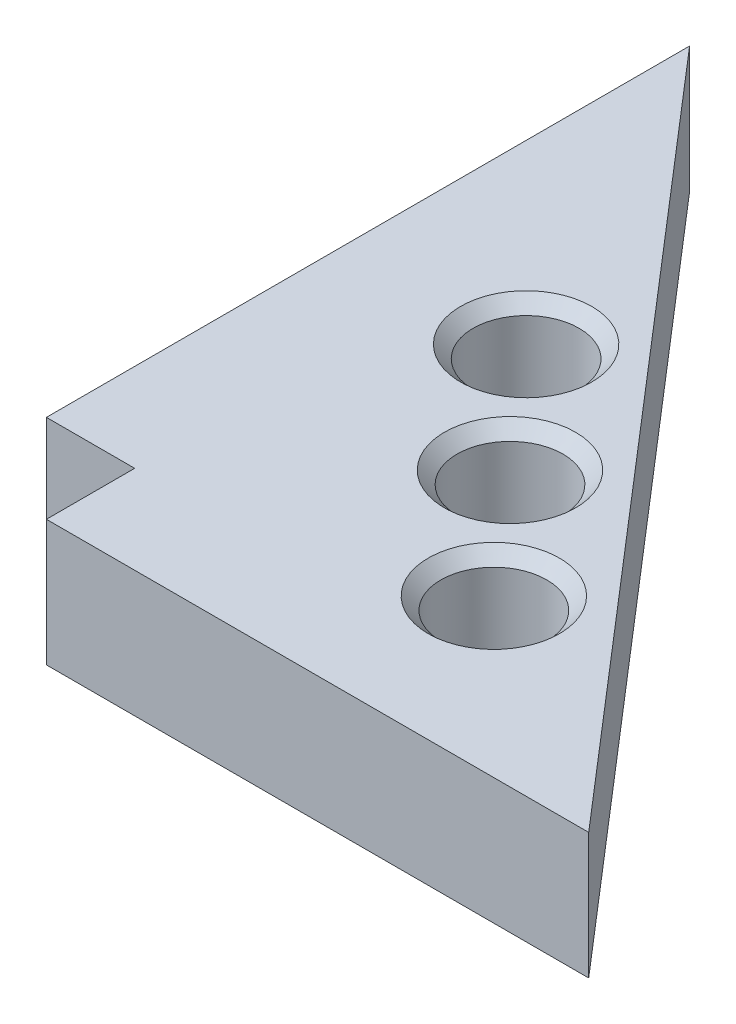
ISO-10303-21;
HEADER;
FILE_DESCRIPTION(('STEP AP214'),'2;1');
FILE_NAME('part.step','',(''),(''),'','','');
FILE_SCHEMA(('AUTOMOTIVE_DESIGN { 1 0 10303 214 1 1 1 1 }'));
ENDSEC;
DATA;
#1=APPLICATION_CONTEXT('core data for automotive mechanical design processes');
#2=APPLICATION_PROTOCOL_DEFINITION('international standard','automotive_design',2000,#1);
#3=PRODUCT_CONTEXT('',#1,'mechanical');
#4=PRODUCT('Part','Part','',(#3));
#5=PRODUCT_RELATED_PRODUCT_CATEGORY('part','',(#4));
#6=PRODUCT_DEFINITION_FORMATION('','',#4);
#7=PRODUCT_DEFINITION_CONTEXT('part definition',#1,'design');
#8=PRODUCT_DEFINITION('design','',#6,#7);
#9=PRODUCT_DEFINITION_SHAPE('','',#8);
#10=(LENGTH_UNIT() NAMED_UNIT(*) SI_UNIT(.MILLI.,.METRE.));
#11=(NAMED_UNIT(*) PLANE_ANGLE_UNIT() SI_UNIT($,.RADIAN.));
#12=(NAMED_UNIT(*) SI_UNIT($,.STERADIAN.) SOLID_ANGLE_UNIT());
#13=UNCERTAINTY_MEASURE_WITH_UNIT(LENGTH_MEASURE(1.E-05),#10,'distance_accuracy_value','');
#14=(GEOMETRIC_REPRESENTATION_CONTEXT(3) GLOBAL_UNCERTAINTY_ASSIGNED_CONTEXT((#13)) GLOBAL_UNIT_ASSIGNED_CONTEXT((#10,
#11,#12)) REPRESENTATION_CONTEXT('',''));
#15=CARTESIAN_POINT('',(0.,0.,0.));
#16=DIRECTION('',(0.,0.,1.));
#17=DIRECTION('',(1.,0.,0.));
#18=AXIS2_PLACEMENT_3D('',#15,#16,#17);
#19=CARTESIAN_POINT('',(0.,3.175,0.));
#20=DIRECTION('',(0.,-1.,0.));
#21=DIRECTION('',(0.,0.,-1.));
#22=AXIS2_PLACEMENT_3D('',#19,#20,#21);
#23=PLANE('',#22);
#24=CARTESIAN_POINT('',(19.05,3.175,-7.92432613589635));
#25=DIRECTION('',(0.,-1.,0.));
#26=DIRECTION('',(0.,0.,-1.));
#27=AXIS2_PLACEMENT_3D('',#24,#25,#26);
#28=CIRCLE('',#27,3.302);
#29=CARTESIAN_POINT('',(19.05,3.175,-4.62232613589635));
#30=VERTEX_POINT('',#29);
#31=EDGE_CURVE('E13',#30,#30,#28,.T.);
#32=ORIENTED_EDGE('',*,*,#31,.T.);
#33=EDGE_LOOP('',(#32));
#34=FACE_BOUND('',#33,.T.);
#35=CARTESIAN_POINT('',(13.97,3.175,-13.8171261358963));
#36=DIRECTION('',(0.,-1.,0.));
#37=DIRECTION('',(0.,0.,-1.));
#38=AXIS2_PLACEMENT_3D('',#35,#36,#37);
#39=CIRCLE('',#38,3.30200000000001);
#40=CARTESIAN_POINT('',(13.97,3.175,-17.1191261358964));
#41=VERTEX_POINT('',#40);
#42=EDGE_CURVE('E67',#41,#41,#39,.T.);
#43=ORIENTED_EDGE('',*,*,#42,.T.);
#44=EDGE_LOOP('',(#43));
#45=FACE_BOUND('',#44,.T.);
#46=CARTESIAN_POINT('',(8.89,3.175,-19.7099261358963));
#47=DIRECTION('',(0.,-1.,0.));
#48=DIRECTION('',(0.,0.,-1.));
#49=AXIS2_PLACEMENT_3D('',#46,#47,#48);
#50=CIRCLE('',#49,3.30200000000001);
#51=CARTESIAN_POINT('',(8.89,3.175,-23.0119261358964));
#52=VERTEX_POINT('',#51);
#53=EDGE_CURVE('E175',#52,#52,#50,.T.);
#54=ORIENTED_EDGE('',*,*,#53,.T.);
#55=EDGE_LOOP('',(#54));
#56=FACE_BOUND('',#55,.T.);
#57=DIRECTION('',(-0.652939622069463,0.,-0.757409961600577));
#58=VECTOR('',#57,1.);
#59=CARTESIAN_POINT('',(31.75,3.175,0.));
#60=LINE('',#59,#58);
#61=CARTESIAN_POINT('',(31.75,3.175,0.));
#62=VERTEX_POINT('',#61);
#63=CARTESIAN_POINT('',(0.,3.175,-36.83));
#64=VERTEX_POINT('',#63);
#65=EDGE_CURVE('E142',#62,#64,#60,.T.);
#66=ORIENTED_EDGE('',*,*,#65,.T.);
#67=DIRECTION('',(0.,0.,1.));
#68=VECTOR('',#67,1.);
#69=CARTESIAN_POINT('',(0.,3.175,-36.83));
#70=LINE('',#69,#68);
#71=CARTESIAN_POINT('',(0.,3.175,-4.445));
#72=VERTEX_POINT('',#71);
#73=EDGE_CURVE('E110',#64,#72,#70,.T.);
#74=ORIENTED_EDGE('',*,*,#73,.T.);
#75=DIRECTION('',(1.,0.,0.));
#76=VECTOR('',#75,1.);
#77=CARTESIAN_POINT('',(0.,3.175,-4.445));
#78=LINE('',#77,#76);
#79=CARTESIAN_POINT('',(4.445,3.175,-4.445));
#80=VERTEX_POINT('',#79);
#81=EDGE_CURVE('E114',#72,#80,#78,.T.);
#82=ORIENTED_EDGE('',*,*,#81,.T.);
#83=DIRECTION('',(0.,0.,1.));
#84=VECTOR('',#83,1.);
#85=CARTESIAN_POINT('',(4.445,3.175,-4.445));
#86=LINE('',#85,#84);
#87=CARTESIAN_POINT('',(4.445,3.175,0.));
#88=VERTEX_POINT('',#87);
#89=EDGE_CURVE('E117',#80,#88,#86,.T.);
#90=ORIENTED_EDGE('',*,*,#89,.T.);
#91=DIRECTION('',(1.,0.,0.));
#92=VECTOR('',#91,1.);
#93=CARTESIAN_POINT('',(4.445,3.175,0.));
#94=LINE('',#93,#92);
#95=EDGE_CURVE('E75',#88,#62,#94,.T.);
#96=ORIENTED_EDGE('',*,*,#95,.T.);
#97=EDGE_LOOP('',(#66,#74,#82,#90,#96));
#98=FACE_BOUND('',#97,.T.);
#99=ADVANCED_FACE('F57',(#34,#45,#56,#98),#23,.F.);
#100=CARTESIAN_POINT('',(0.,-3.175,0.));
#101=DIRECTION('',(0.,-1.,0.));
#102=DIRECTION('',(0.,0.,-1.));
#103=AXIS2_PLACEMENT_3D('',#100,#101,#102);
#104=PLANE('',#103);
#105=CARTESIAN_POINT('',(19.05,-3.175,-7.92432613589635));
#106=DIRECTION('',(0.,-1.,0.));
#107=DIRECTION('',(0.,0.,-1.));
#108=AXIS2_PLACEMENT_3D('',#105,#106,#107);
#109=CIRCLE('',#108,3.30199999999999);
#110=CARTESIAN_POINT('',(19.05,-3.175,-11.2263261358963));
#111=VERTEX_POINT('',#110);
#112=EDGE_CURVE('E154',#111,#111,#109,.F.);
#113=ORIENTED_EDGE('',*,*,#112,.T.);
#114=EDGE_LOOP('',(#113));
#115=FACE_BOUND('',#114,.T.);
#116=CARTESIAN_POINT('',(13.97,-3.175,-13.8171261358963));
#117=DIRECTION('',(0.,-1.,0.));
#118=DIRECTION('',(0.,0.,-1.));
#119=AXIS2_PLACEMENT_3D('',#116,#117,#118);
#120=CIRCLE('',#119,3.30199999999999);
#121=CARTESIAN_POINT('',(13.97,-3.175,-17.1191261358963));
#122=VERTEX_POINT('',#121);
#123=EDGE_CURVE('E151',#122,#122,#120,.F.);
#124=ORIENTED_EDGE('',*,*,#123,.T.);
#125=EDGE_LOOP('',(#124));
#126=FACE_BOUND('',#125,.T.);
#127=CARTESIAN_POINT('',(8.89,-3.175,-19.7099261358963));
#128=DIRECTION('',(0.,-1.,0.));
#129=DIRECTION('',(0.,0.,-1.));
#130=AXIS2_PLACEMENT_3D('',#127,#128,#129);
#131=CIRCLE('',#130,3.302);
#132=CARTESIAN_POINT('',(8.89,-3.175,-23.0119261358963));
#133=VERTEX_POINT('',#132);
#134=EDGE_CURVE('E148',#133,#133,#131,.F.);
#135=ORIENTED_EDGE('',*,*,#134,.T.);
#136=EDGE_LOOP('',(#135));
#137=FACE_BOUND('',#136,.T.);
#138=DIRECTION('',(-0.652939622069463,0.,-0.757409961600577));
#139=VECTOR('',#138,1.);
#140=CARTESIAN_POINT('',(31.75,-3.175,0.));
#141=LINE('',#140,#139);
#142=CARTESIAN_POINT('',(31.75,-3.175,0.));
#143=VERTEX_POINT('',#142);
#144=CARTESIAN_POINT('',(0.,-3.175,-36.83));
#145=VERTEX_POINT('',#144);
#146=EDGE_CURVE('E134',#143,#145,#141,.T.);
#147=ORIENTED_EDGE('',*,*,#146,.F.);
#148=DIRECTION('',(1.,0.,0.));
#149=VECTOR('',#148,1.);
#150=CARTESIAN_POINT('',(4.445,-3.175,0.));
#151=LINE('',#150,#149);
#152=CARTESIAN_POINT('',(4.445,-3.175,0.));
#153=VERTEX_POINT('',#152);
#154=EDGE_CURVE('E101',#153,#143,#151,.T.);
#155=ORIENTED_EDGE('',*,*,#154,.F.);
#156=DIRECTION('',(0.,0.,1.));
#157=VECTOR('',#156,1.);
#158=CARTESIAN_POINT('',(4.445,-3.175,-4.445));
#159=LINE('',#158,#157);
#160=CARTESIAN_POINT('',(4.445,-3.175,-4.445));
#161=VERTEX_POINT('',#160);
#162=EDGE_CURVE('E95',#161,#153,#159,.T.);
#163=ORIENTED_EDGE('',*,*,#162,.F.);
#164=DIRECTION('',(1.,0.,0.));
#165=VECTOR('',#164,1.);
#166=CARTESIAN_POINT('',(0.,-3.175,-4.445));
#167=LINE('',#166,#165);
#168=CARTESIAN_POINT('',(0.,-3.175,-4.445));
#169=VERTEX_POINT('',#168);
#170=EDGE_CURVE('E124',#169,#161,#167,.T.);
#171=ORIENTED_EDGE('',*,*,#170,.F.);
#172=DIRECTION('',(0.,0.,1.));
#173=VECTOR('',#172,1.);
#174=CARTESIAN_POINT('',(0.,-3.175,-36.83));
#175=LINE('',#174,#173);
#176=EDGE_CURVE('E137',#145,#169,#175,.T.);
#177=ORIENTED_EDGE('',*,*,#176,.F.);
#178=EDGE_LOOP('',(#147,#155,#163,#171,#177));
#179=FACE_BOUND('',#178,.T.);
#180=ADVANCED_FACE('F205',(#115,#126,#137,#179),#104,.T.);
#181=CARTESIAN_POINT('',(31.75,3.175,0.));
#182=DIRECTION('',(-0.757409961600577,0.,0.652939622069463));
#183=DIRECTION('',(0.652939622069463,0.,0.757409961600577));
#184=AXIS2_PLACEMENT_3D('',#181,#182,#183);
#185=PLANE('',#184);
#186=ORIENTED_EDGE('',*,*,#146,.T.);
#187=DIRECTION('',(0.,-1.,0.));
#188=VECTOR('',#187,1.);
#189=CARTESIAN_POINT('',(0.,3.175,-36.83));
#190=LINE('',#189,#188);
#191=EDGE_CURVE('E146',#64,#145,#190,.T.);
#192=ORIENTED_EDGE('',*,*,#191,.F.);
#193=ORIENTED_EDGE('',*,*,#65,.F.);
#194=DIRECTION('',(0.,-1.,0.));
#195=VECTOR('',#194,1.);
#196=CARTESIAN_POINT('',(31.75,3.175,0.));
#197=LINE('',#196,#195);
#198=EDGE_CURVE('E130',#62,#143,#197,.T.);
#199=ORIENTED_EDGE('',*,*,#198,.T.);
#200=EDGE_LOOP('',(#186,#192,#193,#199));
#201=FACE_BOUND('',#200,.T.);
#202=ADVANCED_FACE('F212',(#201),#185,.F.);
#203=CARTESIAN_POINT('',(0.,3.175,-36.83));
#204=DIRECTION('',(1.,0.,0.));
#205=DIRECTION('',(0.,0.,-1.));
#206=AXIS2_PLACEMENT_3D('',#203,#204,#205);
#207=PLANE('',#206);
#208=ORIENTED_EDGE('',*,*,#176,.T.);
#209=DIRECTION('',(0.,-1.,0.));
#210=VECTOR('',#209,1.);
#211=CARTESIAN_POINT('',(0.,3.175,-4.445));
#212=LINE('',#211,#210);
#213=EDGE_CURVE('E125',#72,#169,#212,.T.);
#214=ORIENTED_EDGE('',*,*,#213,.F.);
#215=ORIENTED_EDGE('',*,*,#73,.F.);
#216=ORIENTED_EDGE('',*,*,#191,.T.);
#217=EDGE_LOOP('',(#208,#214,#215,#216));
#218=FACE_BOUND('',#217,.T.);
#219=ADVANCED_FACE('F221',(#218),#207,.F.);
#220=CARTESIAN_POINT('',(0.,3.175,-4.445));
#221=DIRECTION('',(0.,0.,-1.));
#222=DIRECTION('',(-1.,0.,0.));
#223=AXIS2_PLACEMENT_3D('',#220,#221,#222);
#224=PLANE('',#223);
#225=ORIENTED_EDGE('',*,*,#170,.T.);
#226=DIRECTION('',(0.,-1.,0.));
#227=VECTOR('',#226,1.);
#228=CARTESIAN_POINT('',(4.445,3.175,-4.445));
#229=LINE('',#228,#227);
#230=EDGE_CURVE('E121',#80,#161,#229,.T.);
#231=ORIENTED_EDGE('',*,*,#230,.F.);
#232=ORIENTED_EDGE('',*,*,#81,.F.);
#233=ORIENTED_EDGE('',*,*,#213,.T.);
#234=EDGE_LOOP('',(#225,#231,#232,#233));
#235=FACE_BOUND('',#234,.T.);
#236=ADVANCED_FACE('F122',(#235),#224,.F.);
#237=CARTESIAN_POINT('',(4.445,3.175,-4.445));
#238=DIRECTION('',(1.,0.,0.));
#239=DIRECTION('',(0.,0.,-1.));
#240=AXIS2_PLACEMENT_3D('',#237,#238,#239);
#241=PLANE('',#240);
#242=ORIENTED_EDGE('',*,*,#162,.T.);
#243=DIRECTION('',(0.,-1.,0.));
#244=VECTOR('',#243,1.);
#245=CARTESIAN_POINT('',(4.445,3.175,0.));
#246=LINE('',#245,#244);
#247=EDGE_CURVE('E126',#88,#153,#246,.T.);
#248=ORIENTED_EDGE('',*,*,#247,.F.);
#249=ORIENTED_EDGE('',*,*,#89,.F.);
#250=ORIENTED_EDGE('',*,*,#230,.T.);
#251=EDGE_LOOP('',(#242,#248,#249,#250));
#252=FACE_BOUND('',#251,.T.);
#253=ADVANCED_FACE('F128',(#252),#241,.F.);
#254=CARTESIAN_POINT('',(4.445,3.175,0.));
#255=DIRECTION('',(0.,0.,-1.));
#256=DIRECTION('',(-1.,0.,0.));
#257=AXIS2_PLACEMENT_3D('',#254,#255,#256);
#258=PLANE('',#257);
#259=ORIENTED_EDGE('',*,*,#154,.T.);
#260=ORIENTED_EDGE('',*,*,#198,.F.);
#261=ORIENTED_EDGE('',*,*,#95,.F.);
#262=ORIENTED_EDGE('',*,*,#247,.T.);
#263=EDGE_LOOP('',(#259,#260,#261,#262));
#264=FACE_BOUND('',#263,.T.);
#265=ADVANCED_FACE('F201',(#264),#258,.F.);
#266=CARTESIAN_POINT('',(8.89,3.175,-19.7099261358963));
#267=DIRECTION('',(0.,-1.,0.));
#268=DIRECTION('',(0.,0.,-1.));
#269=AXIS2_PLACEMENT_3D('',#266,#267,#268);
#270=CYLINDRICAL_SURFACE('',#269,2.667);
#271=CARTESIAN_POINT('',(8.89,-2.54,-19.7099261358963));
#272=DIRECTION('',(0.,-1.,0.));
#273=DIRECTION('',(0.,0.,-1.));
#274=AXIS2_PLACEMENT_3D('',#271,#272,#273);
#275=CIRCLE('',#274,2.667);
#276=CARTESIAN_POINT('',(8.89,-2.54,-22.3769261358963));
#277=VERTEX_POINT('',#276);
#278=EDGE_CURVE('E172',#277,#277,#275,.T.);
#279=ORIENTED_EDGE('',*,*,#278,.T.);
#280=EDGE_LOOP('',(#279));
#281=FACE_BOUND('',#280,.T.);
#282=CARTESIAN_POINT('',(8.89,2.53999999999999,-19.7099261358963));
#283=DIRECTION('',(0.,-1.,0.));
#284=DIRECTION('',(0.,0.,-1.));
#285=AXIS2_PLACEMENT_3D('',#282,#283,#284);
#286=CIRCLE('',#285,2.667);
#287=CARTESIAN_POINT('',(8.89,2.53999999999999,-22.3769261358963));
#288=VERTEX_POINT('',#287);
#289=EDGE_CURVE('E169',#288,#288,#286,.F.);
#290=ORIENTED_EDGE('',*,*,#289,.T.);
#291=EDGE_LOOP('',(#290));
#292=FACE_BOUND('',#291,.T.);
#293=ADVANCED_FACE('F191',(#281,#292),#270,.F.);
#294=CARTESIAN_POINT('',(13.97,3.175,-13.8171261358963));
#295=DIRECTION('',(0.,-1.,0.));
#296=DIRECTION('',(0.,0.,-1.));
#297=AXIS2_PLACEMENT_3D('',#294,#295,#296);
#298=CYLINDRICAL_SURFACE('',#297,2.667);
#299=CARTESIAN_POINT('',(13.97,-2.54,-13.8171261358963));
#300=DIRECTION('',(0.,-1.,0.));
#301=DIRECTION('',(0.,0.,-1.));
#302=AXIS2_PLACEMENT_3D('',#299,#300,#301);
#303=CIRCLE('',#302,2.667);
#304=CARTESIAN_POINT('',(13.97,-2.54,-16.4841261358963));
#305=VERTEX_POINT('',#304);
#306=EDGE_CURVE('E166',#305,#305,#303,.T.);
#307=ORIENTED_EDGE('',*,*,#306,.T.);
#308=EDGE_LOOP('',(#307));
#309=FACE_BOUND('',#308,.T.);
#310=CARTESIAN_POINT('',(13.97,2.53999999999999,-13.8171261358963));
#311=DIRECTION('',(0.,-1.,0.));
#312=DIRECTION('',(0.,0.,-1.));
#313=AXIS2_PLACEMENT_3D('',#310,#311,#312);
#314=CIRCLE('',#313,2.667);
#315=CARTESIAN_POINT('',(13.97,2.53999999999999,-16.4841261358963));
#316=VERTEX_POINT('',#315);
#317=EDGE_CURVE('E163',#316,#316,#314,.F.);
#318=ORIENTED_EDGE('',*,*,#317,.T.);
#319=EDGE_LOOP('',(#318));
#320=FACE_BOUND('',#319,.T.);
#321=ADVANCED_FACE('F188',(#309,#320),#298,.F.);
#322=CARTESIAN_POINT('',(19.05,3.175,-7.92432613589635));
#323=DIRECTION('',(0.,-1.,0.));
#324=DIRECTION('',(0.,0.,-1.));
#325=AXIS2_PLACEMENT_3D('',#322,#323,#324);
#326=CYLINDRICAL_SURFACE('',#325,2.667);
#327=CARTESIAN_POINT('',(19.05,-2.54,-7.92432613589635));
#328=DIRECTION('',(0.,-1.,0.));
#329=DIRECTION('',(0.,0.,-1.));
#330=AXIS2_PLACEMENT_3D('',#327,#328,#329);
#331=CIRCLE('',#330,2.667);
#332=CARTESIAN_POINT('',(19.05,-2.54,-10.5913261358963));
#333=VERTEX_POINT('',#332);
#334=EDGE_CURVE('E160',#333,#333,#331,.T.);
#335=ORIENTED_EDGE('',*,*,#334,.T.);
#336=EDGE_LOOP('',(#335));
#337=FACE_BOUND('',#336,.T.);
#338=CARTESIAN_POINT('',(19.05,2.54,-7.92432613589635));
#339=DIRECTION('',(0.,-1.,0.));
#340=DIRECTION('',(0.,0.,-1.));
#341=AXIS2_PLACEMENT_3D('',#338,#339,#340);
#342=CIRCLE('',#341,2.667);
#343=CARTESIAN_POINT('',(19.05,2.54,-5.25732613589635));
#344=VERTEX_POINT('',#343);
#345=EDGE_CURVE('E157',#344,#344,#342,.F.);
#346=ORIENTED_EDGE('',*,*,#345,.T.);
#347=EDGE_LOOP('',(#346));
#348=FACE_BOUND('',#347,.T.);
#349=ADVANCED_FACE('F190',(#337,#348),#326,.F.);
#350=CARTESIAN_POINT('',(19.05,-3.175,-7.92432613589635));
#351=DIRECTION('',(0.,-1.,0.));
#352=DIRECTION('',(0.,0.,-1.));
#353=AXIS2_PLACEMENT_3D('',#350,#351,#352);
#354=CONICAL_SURFACE('',#353,3.30199999999999,0.785398163397447);
#355=ORIENTED_EDGE('',*,*,#334,.F.);
#356=EDGE_LOOP('',(#355));
#357=FACE_BOUND('',#356,.T.);
#358=ORIENTED_EDGE('',*,*,#112,.F.);
#359=EDGE_LOOP('',(#358));
#360=FACE_BOUND('',#359,.T.);
#361=ADVANCED_FACE('F198',(#357,#360),#354,.F.);
#362=CARTESIAN_POINT('',(13.97,-3.175,-13.8171261358963));
#363=DIRECTION('',(0.,-1.,0.));
#364=DIRECTION('',(0.,0.,-1.));
#365=AXIS2_PLACEMENT_3D('',#362,#363,#364);
#366=CONICAL_SURFACE('',#365,3.30199999999999,0.785398163397443);
#367=ORIENTED_EDGE('',*,*,#306,.F.);
#368=EDGE_LOOP('',(#367));
#369=FACE_BOUND('',#368,.T.);
#370=ORIENTED_EDGE('',*,*,#123,.F.);
#371=EDGE_LOOP('',(#370));
#372=FACE_BOUND('',#371,.T.);
#373=ADVANCED_FACE('F233',(#369,#372),#366,.F.);
#374=CARTESIAN_POINT('',(8.89,-3.175,-19.7099261358963));
#375=DIRECTION('',(0.,-1.,0.));
#376=DIRECTION('',(0.,0.,-1.));
#377=AXIS2_PLACEMENT_3D('',#374,#375,#376);
#378=CONICAL_SURFACE('',#377,3.302,0.785398163397446);
#379=ORIENTED_EDGE('',*,*,#278,.F.);
#380=EDGE_LOOP('',(#379));
#381=FACE_BOUND('',#380,.T.);
#382=ORIENTED_EDGE('',*,*,#134,.F.);
#383=EDGE_LOOP('',(#382));
#384=FACE_BOUND('',#383,.T.);
#385=ADVANCED_FACE('F240',(#381,#384),#378,.F.);
#386=CARTESIAN_POINT('',(19.05,2.54,-7.92432613589635));
#387=DIRECTION('',(0.,1.,0.));
#388=DIRECTION('',(0.,0.,1.));
#389=AXIS2_PLACEMENT_3D('',#386,#387,#388);
#390=CONICAL_SURFACE('',#389,2.667,0.785398163397452);
#391=CARTESIAN_POINT('',(19.05,3.175,-4.62232613589635));
#392=CARTESIAN_POINT('',(19.05,3.16838541666667,-4.62894071922968));
#393=CARTESIAN_POINT('',(19.05,3.16177083333333,-4.63555530256301));
#394=CARTESIAN_POINT('',(19.05,3.14854166666667,-4.64878446922968));
#395=CARTESIAN_POINT('',(19.05,3.14192708333333,-4.65539905256301));
#396=CARTESIAN_POINT('',(19.05,3.12869791666667,-4.66862821922968));
#397=CARTESIAN_POINT('',(19.05,3.12208333333333,-4.67524280256301));
#398=CARTESIAN_POINT('',(19.05,3.10885416666667,-4.68847196922968));
#399=CARTESIAN_POINT('',(19.05,3.10223958333333,-4.69508655256301));
#400=CARTESIAN_POINT('',(19.05,3.08901041666667,-4.70831571922968));
#401=CARTESIAN_POINT('',(19.05,3.08239583333333,-4.71493030256301));
#402=CARTESIAN_POINT('',(19.05,3.06916666666667,-4.72815946922968));
#403=CARTESIAN_POINT('',(19.05,3.06255208333333,-4.73477405256301));
#404=CARTESIAN_POINT('',(19.05,3.04932291666667,-4.74800321922968));
#405=CARTESIAN_POINT('',(19.05,3.04270833333333,-4.75461780256301));
#406=CARTESIAN_POINT('',(19.05,3.02947916666667,-4.76784696922968));
#407=CARTESIAN_POINT('',(19.05,3.02286458333333,-4.77446155256301));
#408=CARTESIAN_POINT('',(19.05,3.00963541666667,-4.78769071922968));
#409=CARTESIAN_POINT('',(19.05,3.00302083333333,-4.79430530256301));
#410=CARTESIAN_POINT('',(19.05,2.98979166666667,-4.80753446922968));
#411=CARTESIAN_POINT('',(19.05,2.98317708333333,-4.81414905256301));
#412=CARTESIAN_POINT('',(19.05,2.96994791666667,-4.82737821922968));
#413=CARTESIAN_POINT('',(19.05,2.96333333333333,-4.83399280256301));
#414=CARTESIAN_POINT('',(19.05,2.95010416666667,-4.84722196922968));
#415=CARTESIAN_POINT('',(19.05,2.94348958333333,-4.85383655256301));
#416=CARTESIAN_POINT('',(19.05,2.93026041666667,-4.86706571922968));
#417=CARTESIAN_POINT('',(19.05,2.92364583333334,-4.87368030256301));
#418=CARTESIAN_POINT('',(19.05,2.91041666666667,-4.88690946922968));
#419=CARTESIAN_POINT('',(19.05,2.90380208333334,-4.89352405256301));
#420=CARTESIAN_POINT('',(19.05,2.89057291666667,-4.90675321922968));
#421=CARTESIAN_POINT('',(19.05,2.88395833333334,-4.91336780256301));
#422=CARTESIAN_POINT('',(19.05,2.87072916666667,-4.92659696922968));
#423=CARTESIAN_POINT('',(19.05,2.86411458333334,-4.93321155256301));
#424=CARTESIAN_POINT('',(19.05,2.85088541666667,-4.94644071922968));
#425=CARTESIAN_POINT('',(19.05,2.84427083333334,-4.95305530256301));
#426=CARTESIAN_POINT('',(19.05,2.83104166666667,-4.96628446922968));
#427=CARTESIAN_POINT('',(19.05,2.82442708333334,-4.97289905256301));
#428=CARTESIAN_POINT('',(19.05,2.81119791666667,-4.98612821922968));
#429=CARTESIAN_POINT('',(19.05,2.80458333333334,-4.99274280256301));
#430=CARTESIAN_POINT('',(19.05,2.79135416666667,-5.00597196922968));
#431=CARTESIAN_POINT('',(19.05,2.78473958333334,-5.01258655256301));
#432=CARTESIAN_POINT('',(19.05,2.77151041666667,-5.02581571922968));
#433=CARTESIAN_POINT('',(19.05,2.76489583333334,-5.03243030256301));
#434=CARTESIAN_POINT('',(19.05,2.75166666666667,-5.04565946922968));
#435=CARTESIAN_POINT('',(19.05,2.74505208333334,-5.05227405256301));
#436=CARTESIAN_POINT('',(19.05,2.73182291666667,-5.06550321922968));
#437=CARTESIAN_POINT('',(19.05,2.72520833333334,-5.07211780256301));
#438=CARTESIAN_POINT('',(19.05,2.71197916666667,-5.08534696922968));
#439=CARTESIAN_POINT('',(19.05,2.70536458333334,-5.09196155256301));
#440=CARTESIAN_POINT('',(19.05,2.69213541666667,-5.10519071922968));
#441=CARTESIAN_POINT('',(19.05,2.68552083333334,-5.11180530256301));
#442=CARTESIAN_POINT('',(19.05,2.67229166666667,-5.12503446922968));
#443=CARTESIAN_POINT('',(19.05,2.66567708333334,-5.13164905256301));
#444=CARTESIAN_POINT('',(19.05,2.65244791666667,-5.14487821922968));
#445=CARTESIAN_POINT('',(19.05,2.64583333333334,-5.15149280256301));
#446=CARTESIAN_POINT('',(19.05,2.63260416666667,-5.16472196922968));
#447=CARTESIAN_POINT('',(19.05,2.62598958333334,-5.17133655256301));
#448=CARTESIAN_POINT('',(19.05,2.61276041666667,-5.18456571922968));
#449=CARTESIAN_POINT('',(19.05,2.60614583333334,-5.19118030256301));
#450=CARTESIAN_POINT('',(19.05,2.59291666666667,-5.20440946922968));
#451=CARTESIAN_POINT('',(19.05,2.58630208333334,-5.21102405256301));
#452=CARTESIAN_POINT('',(19.05,2.57307291666667,-5.22425321922968));
#453=CARTESIAN_POINT('',(19.05,2.56645833333334,-5.23086780256301));
#454=CARTESIAN_POINT('',(19.05,2.55322916666667,-5.24409696922968));
#455=CARTESIAN_POINT('',(19.05,2.54661458333334,-5.25071155256301));
#456=CARTESIAN_POINT('',(19.05,2.54,-5.25732613589635));
#457=B_SPLINE_CURVE_WITH_KNOTS('',3,(#391,#392,#393,#394,#395,#396,#397,#398,#399,#400,#401,
#402,#403,#404,#405,#406,#407,#408,#409,#410,#411,#412,#413,#414,#415,#416,#417,#418,#419,#420,
#421,#422,#423,#424,#425,#426,#427,#428,#429,#430,#431,#432,#433,#434,#435,#436,#437,#438,#439,
#440,#441,#442,#443,#444,#445,#446,#447,#448,#449,#450,#451,#452,#453,#454,#455,#456),
.UNSPECIFIED.,.F.,.F.,(4,2,2,2,2,2,2,2,2,2,2,2,2,2,2,2,2,2,2,2,2,2,2,2,2,2,2,2,2,2,2,2,4),(0.,
0.028063300378341,0.0561266007566819,0.0841899011350229,0.112253201513364,0.140316501891705,
0.168379802270046,0.196443102648387,0.224506403026728,0.252569703405069,0.28063300378341,
0.308696304161751,0.336759604540092,0.364822904918433,0.392886205296774,0.420949505675115,
0.449012806053456,0.477076106431797,0.505139406810138,0.533202707188479,0.56126600756682,
0.589329307945161,0.617392608323502,0.645455908701843,0.673519209080184,0.701582509458526,
0.729645809836866,0.757709110215207,0.785772410593548,0.81383571097189,0.841899011350231,
0.869962311728572,0.898025612106913),.UNSPECIFIED.);
#458=EDGE_CURVE('BSEAM185',#30,#344,#457,.T.);
#459=ORIENTED_EDGE('',*,*,#31,.F.);
#460=ORIENTED_EDGE('',*,*,#345,.F.);
#461=ORIENTED_EDGE('',*,*,#458,.T.);
#462=ORIENTED_EDGE('',*,*,#458,.F.);
#463=EDGE_LOOP('',(#459,#461,#460,#462));
#464=FACE_BOUND('',#463,.T.);
#465=ADVANCED_FACE('F185',(#464),#390,.F.);
#466=CARTESIAN_POINT('',(13.97,2.53999999999999,-13.8171261358963));
#467=DIRECTION('',(0.,1.,0.));
#468=DIRECTION('',(0.,0.,1.));
#469=AXIS2_PLACEMENT_3D('',#466,#467,#468);
#470=CONICAL_SURFACE('',#469,2.667,0.785398163397447);
#471=ORIENTED_EDGE('',*,*,#42,.F.);
#472=EDGE_LOOP('',(#471));
#473=FACE_BOUND('',#472,.T.);
#474=ORIENTED_EDGE('',*,*,#317,.F.);
#475=EDGE_LOOP('',(#474));
#476=FACE_BOUND('',#475,.T.);
#477=ADVANCED_FACE('F182',(#473,#476),#470,.F.);
#478=CARTESIAN_POINT('',(8.89,2.53999999999999,-19.7099261358963));
#479=DIRECTION('',(0.,1.,0.));
#480=DIRECTION('',(0.,0.,1.));
#481=AXIS2_PLACEMENT_3D('',#478,#479,#480);
#482=CONICAL_SURFACE('',#481,2.667,0.785398163397449);
#483=ORIENTED_EDGE('',*,*,#53,.F.);
#484=EDGE_LOOP('',(#483));
#485=FACE_BOUND('',#484,.T.);
#486=ORIENTED_EDGE('',*,*,#289,.F.);
#487=EDGE_LOOP('',(#486));
#488=FACE_BOUND('',#487,.T.);
#489=ADVANCED_FACE('F60',(#485,#488),#482,.F.);
#490=CLOSED_SHELL('',(#99,#180,#202,#219,#236,#253,#265,#293,#321,#349,#361,#373,#385,#465,#477,#489));
#491=MANIFOLD_SOLID_BREP('B2',#490);
#492=ADVANCED_BREP_SHAPE_REPRESENTATION('',(#18,#491),#14);
#493=SHAPE_DEFINITION_REPRESENTATION(#9,#492);
ENDSEC;
END-ISO-10303-21;
